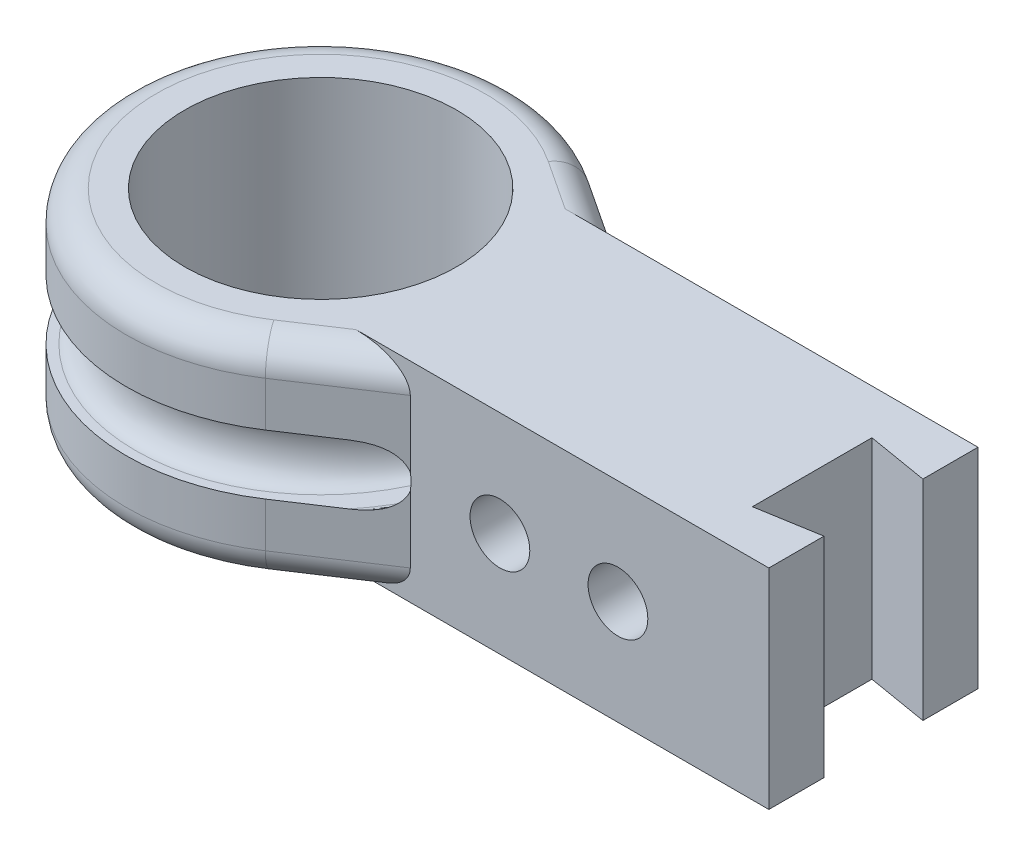
ISO-10303-21;
HEADER;
FILE_DESCRIPTION(('STEP AP214'),'2;1');
FILE_NAME('part.step','',(''),(''),'','','');
FILE_SCHEMA(('AUTOMOTIVE_DESIGN { 1 0 10303 214 1 1 1 1 }'));
ENDSEC;
DATA;
#1=APPLICATION_CONTEXT('core data for automotive mechanical design processes');
#2=APPLICATION_PROTOCOL_DEFINITION('international standard','automotive_design',2000,#1);
#3=PRODUCT_CONTEXT('',#1,'mechanical');
#4=PRODUCT('Part','Part','',(#3));
#5=PRODUCT_RELATED_PRODUCT_CATEGORY('part','',(#4));
#6=PRODUCT_DEFINITION_FORMATION('','',#4);
#7=PRODUCT_DEFINITION_CONTEXT('part definition',#1,'design');
#8=PRODUCT_DEFINITION('design','',#6,#7);
#9=PRODUCT_DEFINITION_SHAPE('','',#8);
#10=(LENGTH_UNIT() NAMED_UNIT(*) SI_UNIT(.MILLI.,.METRE.));
#11=(NAMED_UNIT(*) PLANE_ANGLE_UNIT() SI_UNIT($,.RADIAN.));
#12=(NAMED_UNIT(*) SI_UNIT($,.STERADIAN.) SOLID_ANGLE_UNIT());
#13=UNCERTAINTY_MEASURE_WITH_UNIT(LENGTH_MEASURE(1.E-05),#10,'distance_accuracy_value','');
#14=(GEOMETRIC_REPRESENTATION_CONTEXT(3) GLOBAL_UNCERTAINTY_ASSIGNED_CONTEXT((#13)) GLOBAL_UNIT_ASSIGNED_CONTEXT((#10,
#11,#12)) REPRESENTATION_CONTEXT('',''));
#15=CARTESIAN_POINT('',(0.,0.,0.));
#16=DIRECTION('',(0.,0.,1.));
#17=DIRECTION('',(1.,0.,0.));
#18=AXIS2_PLACEMENT_3D('',#15,#16,#17);
#19=CARTESIAN_POINT('',(6.5,7.,3.5));
#20=DIRECTION('',(0.55045871559633,0.,0.834862385321101));
#21=DIRECTION('',(0.834862385321101,0.,-0.550458715596331));
#22=AXIS2_PLACEMENT_3D('',#19,#20,#21);
#23=PLANE('',#22);
#24=DIRECTION('',(0.,-1.,0.));
#25=VECTOR('',#24,1.);
#26=CARTESIAN_POINT('',(3.57798165137617,7.,5.42660550458714));
#27=LINE('',#26,#25);
#28=CARTESIAN_POINT('',(3.57798165137617,2.5,5.42660550458714));
#29=VERTEX_POINT('',#28);
#30=CARTESIAN_POINT('',(3.57798165137617,1.,5.42660550458714));
#31=VERTEX_POINT('',#30);
#32=EDGE_CURVE('E348',#29,#31,#27,.T.);
#33=ORIENTED_EDGE('',*,*,#32,.T.);
#34=DIRECTION('',(-0.834862385321101,0.,0.550458715596331));
#35=VECTOR('',#34,1.);
#36=CARTESIAN_POINT('',(6.5,1.,3.5));
#37=LINE('',#36,#35);
#38=CARTESIAN_POINT('',(6.5,1.,3.5));
#39=VERTEX_POINT('',#38);
#40=EDGE_CURVE('E442',#31,#39,#37,.F.);
#41=ORIENTED_EDGE('',*,*,#40,.T.);
#42=DIRECTION('',(0.,-1.,0.));
#43=VECTOR('',#42,1.);
#44=CARTESIAN_POINT('',(6.5,7.,3.5));
#45=LINE('',#44,#43);
#46=CARTESIAN_POINT('',(6.5,3.22819521393696,3.5));
#47=VERTEX_POINT('',#46);
#48=EDGE_CURVE('E370',#47,#39,#45,.T.);
#49=ORIENTED_EDGE('',*,*,#48,.F.);
#50=CARTESIAN_POINT('',(6.5,3.22819521393696,3.5));
#51=CARTESIAN_POINT('',(6.49298885962438,3.20469516467334,3.50462272991799));
#52=CARTESIAN_POINT('',(6.48509078213773,3.18159174419673,3.50983025353557));
#53=CARTESIAN_POINT('',(6.4676292095555,3.13632563999783,3.52134337831506));
#54=CARTESIAN_POINT('',(6.45806692554476,3.11416228665261,3.5276481809595));
#55=CARTESIAN_POINT('',(6.4271701424211,3.04954817687565,3.54801968631576));
#56=CARTESIAN_POINT('',(6.40352715088067,3.00864941863856,3.56360847194681));
#57=CARTESIAN_POINT('',(6.35122634688263,2.93199747904386,3.59809251853892));
#58=CARTESIAN_POINT('',(6.32258098093215,2.89623191890055,3.61697957301177));
#59=CARTESIAN_POINT('',(6.26130875530846,2.82999557694114,3.65737884265376));
#60=CARTESIAN_POINT('',(6.22867936221696,2.79952819436519,3.6788927282086));
#61=CARTESIAN_POINT('',(6.14261151228912,2.72931895435917,3.73564076112805));
#62=CARTESIAN_POINT('',(6.08720395804548,2.69304151305721,3.7721732144755));
#63=CARTESIAN_POINT('',(5.97202145654329,2.63130486525718,3.84811772096047));
#64=CARTESIAN_POINT('',(5.91221817444313,2.60592467527972,3.88754845641113));
#65=CARTESIAN_POINT('',(5.80290160328918,2.56869608794661,3.95962531651263));
#66=CARTESIAN_POINT('',(5.75377552755207,2.55514396868166,3.99201613567995));
#67=CARTESIAN_POINT('',(5.65469493921246,2.53298119535897,4.05734399612365));
#68=CARTESIAN_POINT('',(5.6047393361746,2.52437768043018,4.0902817563684));
#69=CARTESIAN_POINT('',(5.50558498743192,2.51141106624854,4.15565825004489));
#70=CARTESIAN_POINT('',(5.45639390173347,2.50695848848075,4.18809193292299));
#71=CARTESIAN_POINT('',(5.35804858954869,2.50126576603422,4.25293499590197));
#72=CARTESIAN_POINT('',(5.30889483077422,2.50001449332246,4.2853440676214));
#73=CARTESIAN_POINT('',(5.25977353990362,2.50000000000001,4.31773173193168));
#74=B_SPLINE_CURVE_WITH_KNOTS('',3,(#50,#51,#52,#53,#54,#55,#56,#57,#58,#59,#60,#61,#62,#63,#64,
#65,#66,#67,#68,#69,#70,#71,#72,#73),.UNSPECIFIED.,.F.,.F.,(4,2,2,2,2,2,2,2,2,2,2,4),(0.,
0.074812067165254,0.149569917637081,0.298065349054375,0.446196437635228,0.594422217290496,
0.820046961292381,1.04728117151874,1.22819830623822,1.40937579153491,1.58655078582427,
1.76310906141737),.UNSPECIFIED.);
#75=CARTESIAN_POINT('',(5.25977353990362,2.5,4.31773173193168));
#76=VERTEX_POINT('',#75);
#77=EDGE_CURVE('E212',#47,#76,#74,.T.);
#78=ORIENTED_EDGE('',*,*,#77,.T.);
#79=DIRECTION('',(-0.834862385321101,0.,0.550458715596331));
#80=VECTOR('',#79,1.);
#81=CARTESIAN_POINT('',(6.5,2.5,3.5));
#82=LINE('',#81,#80);
#83=EDGE_CURVE('E230',#76,#29,#82,.T.);
#84=ORIENTED_EDGE('',*,*,#83,.T.);
#85=EDGE_LOOP('',(#33,#41,#49,#78,#84));
#86=FACE_BOUND('',#85,.T.);
#87=ADVANCED_FACE('F65',(#86),#23,.T.);
#88=CARTESIAN_POINT('',(6.5,6.,3.5));
#89=VERTEX_POINT('',#88);
#90=CARTESIAN_POINT('',(6.5,3.77180478606305,3.5));
#91=VERTEX_POINT('',#90);
#92=EDGE_CURVE('E367',#89,#91,#45,.T.);
#93=ORIENTED_EDGE('',*,*,#92,.F.);
#94=DIRECTION('',(-0.834862385321101,0.,0.550458715596331));
#95=VECTOR('',#94,1.);
#96=CARTESIAN_POINT('',(6.5,6.,3.5));
#97=LINE('',#96,#95);
#98=CARTESIAN_POINT('',(3.57798165137617,6.,5.42660550458714));
#99=VERTEX_POINT('',#98);
#100=EDGE_CURVE('E82',#89,#99,#97,.T.);
#101=ORIENTED_EDGE('',*,*,#100,.T.);
#102=CARTESIAN_POINT('',(3.57798165137617,4.5,5.42660550458714));
#103=VERTEX_POINT('',#102);
#104=EDGE_CURVE('E227',#99,#103,#27,.T.);
#105=ORIENTED_EDGE('',*,*,#104,.T.);
#106=DIRECTION('',(0.834862385321101,0.,-0.550458715596331));
#107=VECTOR('',#106,1.);
#108=CARTESIAN_POINT('',(6.5,4.5,3.5));
#109=LINE('',#108,#107);
#110=CARTESIAN_POINT('',(5.25977353990362,4.5,4.31773173193168));
#111=VERTEX_POINT('',#110);
#112=EDGE_CURVE('E219',#103,#111,#109,.T.);
#113=ORIENTED_EDGE('',*,*,#112,.T.);
#114=CARTESIAN_POINT('',(5.25977353990362,4.49999999999999,4.31773173193168));
#115=CARTESIAN_POINT('',(5.30980424482652,4.49998439536465,4.28474445396054));
#116=CARTESIAN_POINT('',(5.35987068639977,4.49868682887248,4.25173361336279));
#117=CARTESIAN_POINT('',(5.46005090812943,4.49276777287092,4.18568071991466));
#118=CARTESIAN_POINT('',(5.51016414799452,4.48813369889372,4.15263902330032));
#119=CARTESIAN_POINT('',(5.61094447698106,4.47464810066926,4.08619045473776));
#120=CARTESIAN_POINT('',(5.66160493164622,4.46572098860302,4.05278795715634));
#121=CARTESIAN_POINT('',(5.76204144244888,4.44271920763919,3.98656608190183));
#122=CARTESIAN_POINT('',(5.81181878729647,4.42865282179579,3.95374585452979));
#123=CARTESIAN_POINT('',(5.91591925169782,4.39229422808132,3.88510818569373));
#124=CARTESIAN_POINT('',(5.97005539985535,4.36920741181808,3.84941402207339));
#125=CARTESIAN_POINT('',(6.07484169827637,4.31405208518454,3.78032415498262));
#126=CARTESIAN_POINT('',(6.12550687984914,4.2820258141525,3.7469185407588));
#127=CARTESIAN_POINT('',(6.21346194251687,4.21418852231523,3.68892619174711));
#128=CARTESIAN_POINT('',(6.25156972941101,4.17991393322606,3.66380017841032));
#129=CARTESIAN_POINT('',(6.32255321365137,4.10433540844639,3.61699788110899));
#130=CARTESIAN_POINT('',(6.35543710357269,4.06304269401956,3.59531619544659));
#131=CARTESIAN_POINT('',(6.40934731927945,3.98149490764916,3.55977099827729));
#132=CARTESIAN_POINT('',(6.43143912221,3.9422574826338,3.54520497436703));
#133=CARTESIAN_POINT('',(6.46041108861024,3.88047320305739,3.5261025789383));
#134=CARTESIAN_POINT('',(6.46939610863209,3.85931801873014,3.52017838991291));
#135=CARTESIAN_POINT('',(6.4858560007254,3.8161630395596,3.50932571380743));
#136=CARTESIAN_POINT('',(6.49332976949673,3.79416264150562,3.50439795417798));
#137=CARTESIAN_POINT('',(6.5,3.77180478606305,3.5));
#138=B_SPLINE_CURVE_WITH_KNOTS('',3,(#114,#115,#116,#117,#118,#119,#120,#121,#122,#123,#124,
#125,#126,#127,#128,#129,#130,#131,#132,#133,#134,#135,#136,#137),.UNSPECIFIED.,.F.,.F.,(4,2,2,
2,2,2,2,2,2,2,2,4),(0.,0.179831729267228,0.360345315866386,0.544160534446972,0.727680792492196,
0.933606689487284,1.13857558490959,1.309156452813,1.47946710193905,1.62081594714583,
1.69194682388597,1.76312944423503),.UNSPECIFIED.);
#139=EDGE_CURVE('E203',#111,#91,#138,.T.);
#140=ORIENTED_EDGE('',*,*,#139,.T.);
#141=EDGE_LOOP('',(#93,#101,#105,#113,#140));
#142=FACE_BOUND('',#141,.T.);
#143=ADVANCED_FACE('F226',(#142),#23,.T.);
#144=CARTESIAN_POINT('',(6.5,7.,3.5));
#145=DIRECTION('',(0.,0.,-1.));
#146=DIRECTION('',(-1.,0.,0.));
#147=AXIS2_PLACEMENT_3D('',#144,#145,#146);
#148=PLANE('',#147);
#149=CARTESIAN_POINT('',(9.5,3.5,3.5));
#150=DIRECTION('',(0.,0.,1.));
#151=DIRECTION('',(1.,0.,0.));
#152=AXIS2_PLACEMENT_3D('',#149,#150,#151);
#153=CIRCLE('',#152,1.);
#154=CARTESIAN_POINT('',(10.5,3.5,3.5));
#155=VERTEX_POINT('',#154);
#156=EDGE_CURVE('E224',#155,#155,#153,.T.);
#157=ORIENTED_EDGE('',*,*,#156,.F.);
#158=EDGE_LOOP('',(#157));
#159=FACE_BOUND('',#158,.T.);
#160=CARTESIAN_POINT('',(13.45,3.5,3.5));
#161=DIRECTION('',(0.,0.,1.));
#162=DIRECTION('',(1.,0.,0.));
#163=AXIS2_PLACEMENT_3D('',#160,#161,#162);
#164=CIRCLE('',#163,1.);
#165=CARTESIAN_POINT('',(14.45,3.5,3.5));
#166=VERTEX_POINT('',#165);
#167=EDGE_CURVE('E271',#166,#166,#164,.T.);
#168=ORIENTED_EDGE('',*,*,#167,.F.);
#169=EDGE_LOOP('',(#168));
#170=FACE_BOUND('',#169,.T.);
#171=CARTESIAN_POINT('',(6.5,3.22819521393696,3.5));
#172=CARTESIAN_POINT('',(6.5304746179953,3.391795322888,3.50000000000001));
#173=CARTESIAN_POINT('',(6.53381508751579,3.55338363151334,3.50000000000001));
#174=CARTESIAN_POINT('',(6.50709218233565,3.73260551260419,3.5));
#175=CARTESIAN_POINT('',(6.50375171281517,3.75222039468755,3.5));
#176=CARTESIAN_POINT('',(6.5,3.77180478606305,3.5));
#177=B_SPLINE_CURVE_WITH_KNOTS('',3,(#171,#172,#173,#174,#175,#176),.UNSPECIFIED.,.F.,.F.,(4,2,
4),(0.,0.48486849968743,0.544560383740886),.UNSPECIFIED.);
#178=EDGE_CURVE('E210',#47,#91,#177,.T.);
#179=ORIENTED_EDGE('',*,*,#178,.F.);
#180=ORIENTED_EDGE('',*,*,#48,.T.);
#181=CARTESIAN_POINT('',(4.68333333333333,1.,3.5));
#182=DIRECTION('',(0.,0.,-1.));
#183=DIRECTION('',(1.,0.,0.));
#184=AXIS2_PLACEMENT_3D('',#181,#182,#183);
#185=ELLIPSE('',#184,1.81666666666667,1.);
#186=CARTESIAN_POINT('',(4.68333333333333,0.,3.5));
#187=VERTEX_POINT('',#186);
#188=EDGE_CURVE('E460',#39,#187,#185,.T.);
#189=ORIENTED_EDGE('',*,*,#188,.T.);
#190=DIRECTION('',(1.,0.,0.));
#191=VECTOR('',#190,1.);
#192=CARTESIAN_POINT('',(6.5,0.,3.5));
#193=LINE('',#192,#191);
#194=CARTESIAN_POINT('',(18.5,0.,3.5));
#195=VERTEX_POINT('',#194);
#196=EDGE_CURVE('E334',#187,#195,#193,.T.);
#197=ORIENTED_EDGE('',*,*,#196,.T.);
#198=DIRECTION('',(0.,-1.,0.));
#199=VECTOR('',#198,1.);
#200=CARTESIAN_POINT('',(18.5,7.,3.5));
#201=LINE('',#200,#199);
#202=CARTESIAN_POINT('',(18.5,7.,3.5));
#203=VERTEX_POINT('',#202);
#204=EDGE_CURVE('E371',#203,#195,#201,.T.);
#205=ORIENTED_EDGE('',*,*,#204,.F.);
#206=DIRECTION('',(1.,0.,0.));
#207=VECTOR('',#206,1.);
#208=CARTESIAN_POINT('',(6.5,7.,3.5));
#209=LINE('',#208,#207);
#210=CARTESIAN_POINT('',(4.68333333333333,7.,3.5));
#211=VERTEX_POINT('',#210);
#212=EDGE_CURVE('E346',#211,#203,#209,.T.);
#213=ORIENTED_EDGE('',*,*,#212,.F.);
#214=CARTESIAN_POINT('',(4.68333333333333,6.,3.5));
#215=DIRECTION('',(0.,0.,-1.));
#216=DIRECTION('',(-1.,0.,0.));
#217=AXIS2_PLACEMENT_3D('',#214,#215,#216);
#218=ELLIPSE('',#217,1.81666666666667,1.);
#219=EDGE_CURVE('E12',#211,#89,#218,.T.);
#220=ORIENTED_EDGE('',*,*,#219,.T.);
#221=ORIENTED_EDGE('',*,*,#92,.T.);
#222=EDGE_LOOP('',(#179,#180,#189,#197,#205,#213,#220,#221));
#223=FACE_BOUND('',#222,.T.);
#224=ADVANCED_FACE('F303',(#159,#170,#223),#148,.F.);
#225=CARTESIAN_POINT('',(6.5,7.,-3.5));
#226=DIRECTION('',(0.,0.,-1.));
#227=DIRECTION('',(-1.,0.,0.));
#228=AXIS2_PLACEMENT_3D('',#225,#226,#227);
#229=PLANE('',#228);
#230=CARTESIAN_POINT('',(9.5,3.5,-3.5));
#231=DIRECTION('',(0.,0.,-1.));
#232=DIRECTION('',(-1.,0.,0.));
#233=AXIS2_PLACEMENT_3D('',#230,#231,#232);
#234=CIRCLE('',#233,1.);
#235=CARTESIAN_POINT('',(8.5,3.5,-3.5));
#236=VERTEX_POINT('',#235);
#237=EDGE_CURVE('E720',#236,#236,#234,.F.);
#238=ORIENTED_EDGE('',*,*,#237,.T.);
#239=EDGE_LOOP('',(#238));
#240=FACE_BOUND('',#239,.T.);
#241=CARTESIAN_POINT('',(13.45,3.5,-3.5));
#242=DIRECTION('',(0.,0.,-1.));
#243=DIRECTION('',(-1.,0.,0.));
#244=AXIS2_PLACEMENT_3D('',#241,#242,#243);
#245=CIRCLE('',#244,1.);
#246=CARTESIAN_POINT('',(12.45,3.5,-3.5));
#247=VERTEX_POINT('',#246);
#248=EDGE_CURVE('E718',#247,#247,#245,.F.);
#249=ORIENTED_EDGE('',*,*,#248,.T.);
#250=EDGE_LOOP('',(#249));
#251=FACE_BOUND('',#250,.T.);
#252=DIRECTION('',(0.,-1.,0.));
#253=VECTOR('',#252,1.);
#254=CARTESIAN_POINT('',(6.5,7.,-3.5));
#255=LINE('',#254,#253);
#256=CARTESIAN_POINT('',(6.5,3.22819521393695,-3.5));
#257=VERTEX_POINT('',#256);
#258=CARTESIAN_POINT('',(6.5,1.,-3.5));
#259=VERTEX_POINT('',#258);
#260=EDGE_CURVE('E386',#257,#259,#255,.T.);
#261=ORIENTED_EDGE('',*,*,#260,.F.);
#262=CARTESIAN_POINT('',(6.5,3.22819521393695,-3.5));
#263=CARTESIAN_POINT('',(6.53047461799531,3.39179532288799,-3.49999999999998));
#264=CARTESIAN_POINT('',(6.5338150875158,3.55338363151333,-3.49999999999998));
#265=CARTESIAN_POINT('',(6.50709218233565,3.73260551260419,-3.5));
#266=CARTESIAN_POINT('',(6.50375171281517,3.75222039468755,-3.5));
#267=CARTESIAN_POINT('',(6.5,3.77180478606305,-3.5));
#268=B_SPLINE_CURVE_WITH_KNOTS('',3,(#262,#263,#264,#265,#266,#267),.UNSPECIFIED.,.F.,.F.,(4,2,
4),(0.,0.48486849968743,0.544560383740898),.UNSPECIFIED.);
#269=CARTESIAN_POINT('',(6.5,3.77180478606305,-3.5));
#270=VERTEX_POINT('',#269);
#271=EDGE_CURVE('E238',#257,#270,#268,.T.);
#272=ORIENTED_EDGE('',*,*,#271,.T.);
#273=CARTESIAN_POINT('',(6.5,6.,-3.5));
#274=VERTEX_POINT('',#273);
#275=EDGE_CURVE('E384',#274,#270,#255,.T.);
#276=ORIENTED_EDGE('',*,*,#275,.F.);
#277=CARTESIAN_POINT('',(4.68333333333333,6.,-3.5));
#278=DIRECTION('',(0.,0.,-1.));
#279=DIRECTION('',(1.,0.,0.));
#280=AXIS2_PLACEMENT_3D('',#277,#278,#279);
#281=ELLIPSE('',#280,1.81666666666667,1.);
#282=CARTESIAN_POINT('',(4.68333333333333,7.,-3.5));
#283=VERTEX_POINT('',#282);
#284=EDGE_CURVE('E74',#274,#283,#281,.F.);
#285=ORIENTED_EDGE('',*,*,#284,.T.);
#286=DIRECTION('',(1.,0.,0.));
#287=VECTOR('',#286,1.);
#288=CARTESIAN_POINT('',(6.5,7.,-3.5));
#289=LINE('',#288,#287);
#290=CARTESIAN_POINT('',(18.5,7.,-3.5));
#291=VERTEX_POINT('',#290);
#292=EDGE_CURVE('E330',#283,#291,#289,.T.);
#293=ORIENTED_EDGE('',*,*,#292,.T.);
#294=DIRECTION('',(0.,-1.,0.));
#295=VECTOR('',#294,1.);
#296=CARTESIAN_POINT('',(18.5,7.,-3.5));
#297=LINE('',#296,#295);
#298=CARTESIAN_POINT('',(18.5,0.,-3.5));
#299=VERTEX_POINT('',#298);
#300=EDGE_CURVE('E382',#291,#299,#297,.T.);
#301=ORIENTED_EDGE('',*,*,#300,.T.);
#302=DIRECTION('',(1.,0.,0.));
#303=VECTOR('',#302,1.);
#304=CARTESIAN_POINT('',(6.5,0.,-3.5));
#305=LINE('',#304,#303);
#306=CARTESIAN_POINT('',(4.68333333333333,0.,-3.5));
#307=VERTEX_POINT('',#306);
#308=EDGE_CURVE('E327',#307,#299,#305,.T.);
#309=ORIENTED_EDGE('',*,*,#308,.F.);
#310=CARTESIAN_POINT('',(4.68333333333333,1.,-3.5));
#311=DIRECTION('',(0.,0.,-1.));
#312=DIRECTION('',(-1.,0.,0.));
#313=AXIS2_PLACEMENT_3D('',#310,#311,#312);
#314=ELLIPSE('',#313,1.81666666666667,1.);
#315=EDGE_CURVE('E430',#307,#259,#314,.F.);
#316=ORIENTED_EDGE('',*,*,#315,.T.);
#317=EDGE_LOOP('',(#261,#272,#276,#285,#293,#301,#309,#316));
#318=FACE_BOUND('',#317,.T.);
#319=ADVANCED_FACE('F252',(#240,#251,#318),#229,.T.);
#320=CARTESIAN_POINT('',(6.5,7.,-3.5));
#321=DIRECTION('',(-0.550458715596331,0.,0.834862385321101));
#322=DIRECTION('',(0.834862385321101,0.,0.550458715596331));
#323=AXIS2_PLACEMENT_3D('',#320,#321,#322);
#324=PLANE('',#323);
#325=ORIENTED_EDGE('',*,*,#260,.T.);
#326=DIRECTION('',(-0.834862385321101,0.,-0.550458715596331));
#327=VECTOR('',#326,1.);
#328=CARTESIAN_POINT('',(6.5,1.,-3.5));
#329=LINE('',#328,#327);
#330=CARTESIAN_POINT('',(3.57798165137615,1.,-5.42660550458716));
#331=VERTEX_POINT('',#330);
#332=EDGE_CURVE('E423',#259,#331,#329,.T.);
#333=ORIENTED_EDGE('',*,*,#332,.T.);
#334=DIRECTION('',(0.,-1.,0.));
#335=VECTOR('',#334,1.);
#336=CARTESIAN_POINT('',(3.57798165137615,7.,-5.42660550458716));
#337=LINE('',#336,#335);
#338=CARTESIAN_POINT('',(3.57798165137615,2.5,-5.42660550458716));
#339=VERTEX_POINT('',#338);
#340=EDGE_CURVE('E389',#339,#331,#337,.T.);
#341=ORIENTED_EDGE('',*,*,#340,.F.);
#342=DIRECTION('',(-0.834862385321101,0.,-0.550458715596331));
#343=VECTOR('',#342,1.);
#344=CARTESIAN_POINT('',(6.5,2.5,-3.5));
#345=LINE('',#344,#343);
#346=CARTESIAN_POINT('',(5.25977353990362,2.5,-4.31773173193168));
#347=VERTEX_POINT('',#346);
#348=EDGE_CURVE('E228',#347,#339,#345,.T.);
#349=ORIENTED_EDGE('',*,*,#348,.F.);
#350=CARTESIAN_POINT('',(6.5,3.22819521393695,-3.5));
#351=CARTESIAN_POINT('',(6.49298885962437,3.20469516467334,-3.50462272991799));
#352=CARTESIAN_POINT('',(6.48509078213772,3.18159174419672,-3.50983025353557));
#353=CARTESIAN_POINT('',(6.4676292095555,3.13632563999783,-3.52134337831506));
#354=CARTESIAN_POINT('',(6.45806692554476,3.1141622866526,-3.5276481809595));
#355=CARTESIAN_POINT('',(6.4271701424211,3.04954817687564,-3.54801968631576));
#356=CARTESIAN_POINT('',(6.40352715088067,3.00864941863855,-3.56360847194681));
#357=CARTESIAN_POINT('',(6.35122634688263,2.93199747904385,-3.59809251853893));
#358=CARTESIAN_POINT('',(6.32258098093214,2.89623191890054,-3.61697957301177));
#359=CARTESIAN_POINT('',(6.26130875530845,2.82999557694114,-3.65737884265377));
#360=CARTESIAN_POINT('',(6.22867936221695,2.79952819436519,-3.6788927282086));
#361=CARTESIAN_POINT('',(6.14261151228911,2.72931895435917,-3.73564076112805));
#362=CARTESIAN_POINT('',(6.08720395804548,2.69304151305721,-3.77217321447551));
#363=CARTESIAN_POINT('',(5.97202145654328,2.63130486525718,-3.84811772096047));
#364=CARTESIAN_POINT('',(5.91221817444312,2.60592467527971,-3.88754845641113));
#365=CARTESIAN_POINT('',(5.80290160328917,2.5686960879466,-3.95962531651264));
#366=CARTESIAN_POINT('',(5.75377552755207,2.55514396868166,-3.99201613567995));
#367=CARTESIAN_POINT('',(5.65469493921245,2.53298119535897,-4.05734399612366));
#368=CARTESIAN_POINT('',(5.60473933617459,2.52437768043018,-4.0902817563684));
#369=CARTESIAN_POINT('',(5.50558498743192,2.51141106624854,-4.15565825004489));
#370=CARTESIAN_POINT('',(5.45639390173347,2.50695848848075,-4.18809193292299));
#371=CARTESIAN_POINT('',(5.35804858954869,2.50126576603422,-4.25293499590196));
#372=CARTESIAN_POINT('',(5.30889483077422,2.50001449332246,-4.28534406762139));
#373=CARTESIAN_POINT('',(5.25977353990362,2.50000000000001,-4.31773173193167));
#374=B_SPLINE_CURVE_WITH_KNOTS('',3,(#350,#351,#352,#353,#354,#355,#356,#357,#358,#359,#360,
#361,#362,#363,#364,#365,#366,#367,#368,#369,#370,#371,#372,#373),.UNSPECIFIED.,.F.,.F.,(4,2,2,
2,2,2,2,2,2,2,2,4),(0.,0.0748120671652539,0.149569917637081,0.298065349054377,0.446196437635229,
0.594422217290497,0.820046961292383,1.04728117151874,1.22819830623822,1.40937579153491,
1.58655078582426,1.76310906141736),.UNSPECIFIED.);
#375=EDGE_CURVE('E399',#257,#347,#374,.T.);
#376=ORIENTED_EDGE('',*,*,#375,.F.);
#377=EDGE_LOOP('',(#325,#333,#341,#349,#376));
#378=FACE_BOUND('',#377,.T.);
#379=ADVANCED_FACE('F405',(#378),#324,.F.);
#380=CARTESIAN_POINT('',(3.57798165137615,6.,-5.42660550458716));
#381=VERTEX_POINT('',#380);
#382=CARTESIAN_POINT('',(3.57798165137615,4.5,-5.42660550458716));
#383=VERTEX_POINT('',#382);
#384=EDGE_CURVE('E387',#381,#383,#337,.T.);
#385=ORIENTED_EDGE('',*,*,#384,.F.);
#386=DIRECTION('',(-0.834862385321101,0.,-0.550458715596331));
#387=VECTOR('',#386,1.);
#388=CARTESIAN_POINT('',(6.5,6.,-3.5));
#389=LINE('',#388,#387);
#390=EDGE_CURVE('E452',#381,#274,#389,.F.);
#391=ORIENTED_EDGE('',*,*,#390,.T.);
#392=ORIENTED_EDGE('',*,*,#275,.T.);
#393=CARTESIAN_POINT('',(5.25977353990362,4.49999999999999,-4.31773173193168));
#394=CARTESIAN_POINT('',(5.30980424482652,4.49998439536465,-4.28474445396054));
#395=CARTESIAN_POINT('',(5.35987068639978,4.49868682887249,-4.25173361336279));
#396=CARTESIAN_POINT('',(5.46005090812944,4.49276777287092,-4.18568071991466));
#397=CARTESIAN_POINT('',(5.51016414799452,4.48813369889372,-4.15263902330031));
#398=CARTESIAN_POINT('',(5.61094447698106,4.47464810066926,-4.08619045473776));
#399=CARTESIAN_POINT('',(5.66160493164622,4.46572098860302,-4.05278795715634));
#400=CARTESIAN_POINT('',(5.76204144244888,4.44271920763919,-3.98656608190183));
#401=CARTESIAN_POINT('',(5.81181878729647,4.42865282179579,-3.95374585452979));
#402=CARTESIAN_POINT('',(5.91591925169783,4.39229422808132,-3.88510818569373));
#403=CARTESIAN_POINT('',(5.97005539985535,4.36920741181808,-3.84941402207339));
#404=CARTESIAN_POINT('',(6.07484169827637,4.31405208518454,-3.78032415498262));
#405=CARTESIAN_POINT('',(6.12550687984914,4.2820258141525,-3.7469185407588));
#406=CARTESIAN_POINT('',(6.21346194251688,4.21418852231523,-3.68892619174711));
#407=CARTESIAN_POINT('',(6.25156972941101,4.17991393322605,-3.66380017841032));
#408=CARTESIAN_POINT('',(6.32255321365138,4.10433540844639,-3.61699788110898));
#409=CARTESIAN_POINT('',(6.35543710357269,4.06304269401956,-3.59531619544657));
#410=CARTESIAN_POINT('',(6.40934731927945,3.98149490764916,-3.55977099827728));
#411=CARTESIAN_POINT('',(6.43143912221,3.9422574826338,-3.54520497436703));
#412=CARTESIAN_POINT('',(6.46041108861024,3.88047320305738,-3.5261025789383));
#413=CARTESIAN_POINT('',(6.46939610863209,3.85931801873014,-3.52017838991291));
#414=CARTESIAN_POINT('',(6.4858560007254,3.81616303955961,-3.50932571380743));
#415=CARTESIAN_POINT('',(6.49332976949673,3.79416264150563,-3.50439795417798));
#416=CARTESIAN_POINT('',(6.5,3.77180478606305,-3.5));
#417=B_SPLINE_CURVE_WITH_KNOTS('',3,(#393,#394,#395,#396,#397,#398,#399,#400,#401,#402,#403,
#404,#405,#406,#407,#408,#409,#410,#411,#412,#413,#414,#415,#416),.UNSPECIFIED.,.F.,.F.,(4,2,2,
2,2,2,2,2,2,2,2,4),(0.,0.179831729267229,0.360345315866388,0.544160534446972,0.727680792492197,
0.933606689487283,1.13857558490959,1.309156452813,1.47946710193905,1.62081594714583,
1.69194682388597,1.76312944423502),.UNSPECIFIED.);
#418=CARTESIAN_POINT('',(5.25977353990362,4.5,-4.31773173193168));
#419=VERTEX_POINT('',#418);
#420=EDGE_CURVE('E393',#419,#270,#417,.T.);
#421=ORIENTED_EDGE('',*,*,#420,.F.);
#422=DIRECTION('',(0.834862385321101,0.,0.550458715596331));
#423=VECTOR('',#422,1.);
#424=CARTESIAN_POINT('',(6.5,4.5,-3.5));
#425=LINE('',#424,#423);
#426=EDGE_CURVE('E222',#383,#419,#425,.T.);
#427=ORIENTED_EDGE('',*,*,#426,.F.);
#428=EDGE_LOOP('',(#385,#391,#392,#421,#427));
#429=FACE_BOUND('',#428,.T.);
#430=ADVANCED_FACE('F408',(#429),#324,.F.);
#431=CARTESIAN_POINT('',(0.,7.,0.));
#432=DIRECTION('',(0.,-1.,0.));
#433=DIRECTION('',(0.,0.,-1.));
#434=AXIS2_PLACEMENT_3D('',#431,#432,#433);
#435=CYLINDRICAL_SURFACE('',#434,6.5);
#436=ORIENTED_EDGE('',*,*,#340,.T.);
#437=CARTESIAN_POINT('',(0.,1.,0.));
#438=DIRECTION('',(0.,1.,0.));
#439=DIRECTION('',(0.,0.,1.));
#440=AXIS2_PLACEMENT_3D('',#437,#438,#439);
#441=CIRCLE('',#440,6.5);
#442=EDGE_CURVE('E455',#331,#31,#441,.T.);
#443=ORIENTED_EDGE('',*,*,#442,.T.);
#444=ORIENTED_EDGE('',*,*,#32,.F.);
#445=CARTESIAN_POINT('',(0.,2.5,0.));
#446=DIRECTION('',(0.,1.,0.));
#447=DIRECTION('',(0.,0.,1.));
#448=AXIS2_PLACEMENT_3D('',#445,#446,#447);
#449=CIRCLE('',#448,6.5);
#450=EDGE_CURVE('E392',#339,#29,#449,.T.);
#451=ORIENTED_EDGE('',*,*,#450,.F.);
#452=EDGE_LOOP('',(#436,#443,#444,#451));
#453=FACE_BOUND('',#452,.T.);
#454=ADVANCED_FACE('F308',(#453),#435,.T.);
#455=ORIENTED_EDGE('',*,*,#104,.F.);
#456=CARTESIAN_POINT('',(0.,6.,0.));
#457=DIRECTION('',(0.,1.,0.));
#458=DIRECTION('',(0.,0.,1.));
#459=AXIS2_PLACEMENT_3D('',#456,#457,#458);
#460=CIRCLE('',#459,6.5);
#461=EDGE_CURVE('E457',#99,#381,#460,.F.);
#462=ORIENTED_EDGE('',*,*,#461,.T.);
#463=ORIENTED_EDGE('',*,*,#384,.T.);
#464=CARTESIAN_POINT('',(0.,4.5,0.));
#465=DIRECTION('',(0.,-1.,0.));
#466=DIRECTION('',(0.,0.,-1.));
#467=AXIS2_PLACEMENT_3D('',#464,#465,#466);
#468=CIRCLE('',#467,6.5);
#469=EDGE_CURVE('E369',#103,#383,#468,.T.);
#470=ORIENTED_EDGE('',*,*,#469,.F.);
#471=EDGE_LOOP('',(#455,#462,#463,#470));
#472=FACE_BOUND('',#471,.T.);
#473=ADVANCED_FACE('F577',(#472),#435,.T.);
#474=CARTESIAN_POINT('',(0.,7.,0.));
#475=DIRECTION('',(0.,1.,0.));
#476=DIRECTION('',(0.,0.,1.));
#477=AXIS2_PLACEMENT_3D('',#474,#475,#476);
#478=PLANE('',#477);
#479=ORIENTED_EDGE('',*,*,#292,.F.);
#480=DIRECTION('',(-0.834862385321101,0.,-0.550458715596331));
#481=VECTOR('',#480,1.);
#482=CARTESIAN_POINT('',(3.02752293577982,7.,-4.59174311926605));
#483=LINE('',#482,#481);
#484=CARTESIAN_POINT('',(3.02752293577982,7.,-4.59174311926605));
#485=VERTEX_POINT('',#484);
#486=EDGE_CURVE('E449',#283,#485,#483,.T.);
#487=ORIENTED_EDGE('',*,*,#486,.T.);
#488=CARTESIAN_POINT('',(0.,7.,0.));
#489=DIRECTION('',(0.,1.,0.));
#490=DIRECTION('',(0.,0.,1.));
#491=AXIS2_PLACEMENT_3D('',#488,#489,#490);
#492=CIRCLE('',#491,5.5);
#493=CARTESIAN_POINT('',(3.02752293577984,7.,4.59174311926604));
#494=VERTEX_POINT('',#493);
#495=EDGE_CURVE('E444',#485,#494,#492,.T.);
#496=ORIENTED_EDGE('',*,*,#495,.T.);
#497=DIRECTION('',(-0.834862385321101,0.,0.550458715596331));
#498=VECTOR('',#497,1.);
#499=CARTESIAN_POINT('',(3.02752293577982,7.,4.59174311926605));
#500=LINE('',#499,#498);
#501=EDGE_CURVE('E446',#494,#211,#500,.F.);
#502=ORIENTED_EDGE('',*,*,#501,.T.);
#503=ORIENTED_EDGE('',*,*,#212,.T.);
#504=DIRECTION('',(0.,0.,-1.));
#505=VECTOR('',#504,1.);
#506=CARTESIAN_POINT('',(18.5,7.,3.5));
#507=LINE('',#506,#505);
#508=CARTESIAN_POINT('',(18.5,7.,1.655));
#509=VERTEX_POINT('',#508);
#510=EDGE_CURVE('E344',#203,#509,#507,.T.);
#511=ORIENTED_EDGE('',*,*,#510,.T.);
#512=DIRECTION('',(0.986132668242457,0.,-0.165958912460317));
#513=VECTOR('',#512,1.);
#514=CARTESIAN_POINT('',(16.45,7.,2.));
#515=LINE('',#514,#513);
#516=CARTESIAN_POINT('',(16.45,7.,2.));
#517=VERTEX_POINT('',#516);
#518=EDGE_CURVE('E341',#517,#509,#515,.T.);
#519=ORIENTED_EDGE('',*,*,#518,.F.);
#520=DIRECTION('',(0.,0.,-1.));
#521=VECTOR('',#520,1.);
#522=CARTESIAN_POINT('',(16.45,7.,2.));
#523=LINE('',#522,#521);
#524=CARTESIAN_POINT('',(16.45,7.,-2.));
#525=VERTEX_POINT('',#524);
#526=EDGE_CURVE('E339',#517,#525,#523,.T.);
#527=ORIENTED_EDGE('',*,*,#526,.T.);
#528=DIRECTION('',(-0.986132668242457,0.,-0.165958912460317));
#529=VECTOR('',#528,1.);
#530=CARTESIAN_POINT('',(18.5,7.,-1.655));
#531=LINE('',#530,#529);
#532=CARTESIAN_POINT('',(18.5,7.,-1.655));
#533=VERTEX_POINT('',#532);
#534=EDGE_CURVE('E336',#533,#525,#531,.T.);
#535=ORIENTED_EDGE('',*,*,#534,.F.);
#536=DIRECTION('',(0.,0.,-1.));
#537=VECTOR('',#536,1.);
#538=CARTESIAN_POINT('',(18.5,7.,-1.655));
#539=LINE('',#538,#537);
#540=EDGE_CURVE('E333',#533,#291,#539,.T.);
#541=ORIENTED_EDGE('',*,*,#540,.T.);
#542=EDGE_LOOP('',(#479,#487,#496,#502,#503,#511,#519,#527,#535,#541));
#543=FACE_BOUND('',#542,.T.);
#544=CARTESIAN_POINT('',(0.,7.,0.));
#545=DIRECTION('',(0.,1.,0.));
#546=DIRECTION('',(0.,0.,1.));
#547=AXIS2_PLACEMENT_3D('',#544,#545,#546);
#548=CIRCLE('',#547,4.55);
#549=CARTESIAN_POINT('',(0.,7.,4.55));
#550=VERTEX_POINT('',#549);
#551=EDGE_CURVE('E324',#550,#550,#548,.T.);
#552=ORIENTED_EDGE('',*,*,#551,.F.);
#553=EDGE_LOOP('',(#552));
#554=FACE_BOUND('',#553,.T.);
#555=ADVANCED_FACE('F482',(#543,#554),#478,.T.);
#556=CARTESIAN_POINT('',(0.,0.,0.));
#557=DIRECTION('',(0.,1.,0.));
#558=DIRECTION('',(0.,0.,1.));
#559=AXIS2_PLACEMENT_3D('',#556,#557,#558);
#560=PLANE('',#559);
#561=DIRECTION('',(-0.834862385321101,0.,-0.550458715596331));
#562=VECTOR('',#561,1.);
#563=CARTESIAN_POINT('',(3.02752293577982,0.,-4.59174311926605));
#564=LINE('',#563,#562);
#565=CARTESIAN_POINT('',(3.02752293577982,0.,-4.59174311926605));
#566=VERTEX_POINT('',#565);
#567=EDGE_CURVE('E439',#566,#307,#564,.F.);
#568=ORIENTED_EDGE('',*,*,#567,.T.);
#569=ORIENTED_EDGE('',*,*,#308,.T.);
#570=DIRECTION('',(0.,0.,-1.));
#571=VECTOR('',#570,1.);
#572=CARTESIAN_POINT('',(18.5,0.,-1.655));
#573=LINE('',#572,#571);
#574=CARTESIAN_POINT('',(18.5,0.,-1.655));
#575=VERTEX_POINT('',#574);
#576=EDGE_CURVE('E351',#575,#299,#573,.T.);
#577=ORIENTED_EDGE('',*,*,#576,.F.);
#578=DIRECTION('',(-0.986132668242457,0.,-0.165958912460317));
#579=VECTOR('',#578,1.);
#580=CARTESIAN_POINT('',(18.5,0.,-1.655));
#581=LINE('',#580,#579);
#582=CARTESIAN_POINT('',(16.45,0.,-2.));
#583=VERTEX_POINT('',#582);
#584=EDGE_CURVE('E354',#575,#583,#581,.T.);
#585=ORIENTED_EDGE('',*,*,#584,.T.);
#586=DIRECTION('',(0.,0.,-1.));
#587=VECTOR('',#586,1.);
#588=CARTESIAN_POINT('',(16.45,0.,2.));
#589=LINE('',#588,#587);
#590=CARTESIAN_POINT('',(16.45,0.,2.));
#591=VERTEX_POINT('',#590);
#592=EDGE_CURVE('E357',#591,#583,#589,.T.);
#593=ORIENTED_EDGE('',*,*,#592,.F.);
#594=DIRECTION('',(0.986132668242457,0.,-0.165958912460317));
#595=VECTOR('',#594,1.);
#596=CARTESIAN_POINT('',(16.45,0.,2.));
#597=LINE('',#596,#595);
#598=CARTESIAN_POINT('',(18.5,0.,1.655));
#599=VERTEX_POINT('',#598);
#600=EDGE_CURVE('E360',#591,#599,#597,.T.);
#601=ORIENTED_EDGE('',*,*,#600,.T.);
#602=DIRECTION('',(0.,0.,-1.));
#603=VECTOR('',#602,1.);
#604=CARTESIAN_POINT('',(18.5,0.,3.5));
#605=LINE('',#604,#603);
#606=EDGE_CURVE('E363',#195,#599,#605,.T.);
#607=ORIENTED_EDGE('',*,*,#606,.F.);
#608=ORIENTED_EDGE('',*,*,#196,.F.);
#609=DIRECTION('',(-0.834862385321101,0.,0.550458715596331));
#610=VECTOR('',#609,1.);
#611=CARTESIAN_POINT('',(3.02752293577984,0.,4.59174311926604));
#612=LINE('',#611,#610);
#613=CARTESIAN_POINT('',(3.02752293577984,0.,4.59174311926604));
#614=VERTEX_POINT('',#613);
#615=EDGE_CURVE('E435',#187,#614,#612,.T.);
#616=ORIENTED_EDGE('',*,*,#615,.T.);
#617=CARTESIAN_POINT('',(0.,0.,0.));
#618=DIRECTION('',(0.,1.,0.));
#619=DIRECTION('',(0.,0.,1.));
#620=AXIS2_PLACEMENT_3D('',#617,#618,#619);
#621=CIRCLE('',#620,5.5);
#622=EDGE_CURVE('E434',#614,#566,#621,.F.);
#623=ORIENTED_EDGE('',*,*,#622,.T.);
#624=EDGE_LOOP('',(#568,#569,#577,#585,#593,#601,#607,#608,#616,#623));
#625=FACE_BOUND('',#624,.T.);
#626=CARTESIAN_POINT('',(0.,0.,0.));
#627=DIRECTION('',(0.,1.,0.));
#628=DIRECTION('',(0.,0.,1.));
#629=AXIS2_PLACEMENT_3D('',#626,#627,#628);
#630=CIRCLE('',#629,4.55);
#631=CARTESIAN_POINT('',(0.,0.,4.55));
#632=VERTEX_POINT('',#631);
#633=EDGE_CURVE('E323',#632,#632,#630,.T.);
#634=ORIENTED_EDGE('',*,*,#633,.T.);
#635=EDGE_LOOP('',(#634));
#636=FACE_BOUND('',#635,.T.);
#637=ADVANCED_FACE('F505',(#625,#636),#560,.F.);
#638=CARTESIAN_POINT('',(18.5,7.,3.5));
#639=DIRECTION('',(-1.,0.,0.));
#640=DIRECTION('',(0.,0.,1.));
#641=AXIS2_PLACEMENT_3D('',#638,#639,#640);
#642=PLANE('',#641);
#643=ORIENTED_EDGE('',*,*,#606,.T.);
#644=DIRECTION('',(0.,-1.,0.));
#645=VECTOR('',#644,1.);
#646=CARTESIAN_POINT('',(18.5,7.,1.655));
#647=LINE('',#646,#645);
#648=EDGE_CURVE('E374',#509,#599,#647,.T.);
#649=ORIENTED_EDGE('',*,*,#648,.F.);
#650=ORIENTED_EDGE('',*,*,#510,.F.);
#651=ORIENTED_EDGE('',*,*,#204,.T.);
#652=EDGE_LOOP('',(#643,#649,#650,#651));
#653=FACE_BOUND('',#652,.T.);
#654=ADVANCED_FACE('F510',(#653),#642,.F.);
#655=CARTESIAN_POINT('',(16.45,7.,2.));
#656=DIRECTION('',(-0.165958912460317,0.,-0.986132668242457));
#657=DIRECTION('',(-0.986132668242457,0.,0.165958912460317));
#658=AXIS2_PLACEMENT_3D('',#655,#656,#657);
#659=PLANE('',#658);
#660=ORIENTED_EDGE('',*,*,#600,.F.);
#661=DIRECTION('',(0.,-1.,0.));
#662=VECTOR('',#661,1.);
#663=CARTESIAN_POINT('',(16.45,7.,2.));
#664=LINE('',#663,#662);
#665=EDGE_CURVE('E376',#517,#591,#664,.T.);
#666=ORIENTED_EDGE('',*,*,#665,.F.);
#667=ORIENTED_EDGE('',*,*,#518,.T.);
#668=ORIENTED_EDGE('',*,*,#648,.T.);
#669=EDGE_LOOP('',(#660,#666,#667,#668));
#670=FACE_BOUND('',#669,.T.);
#671=ADVANCED_FACE('F518',(#670),#659,.T.);
#672=CARTESIAN_POINT('',(16.45,7.,2.));
#673=DIRECTION('',(-1.,0.,0.));
#674=DIRECTION('',(0.,0.,1.));
#675=AXIS2_PLACEMENT_3D('',#672,#673,#674);
#676=PLANE('',#675);
#677=ORIENTED_EDGE('',*,*,#592,.T.);
#678=DIRECTION('',(0.,-1.,0.));
#679=VECTOR('',#678,1.);
#680=CARTESIAN_POINT('',(16.45,7.,-2.));
#681=LINE('',#680,#679);
#682=EDGE_CURVE('E378',#525,#583,#681,.T.);
#683=ORIENTED_EDGE('',*,*,#682,.F.);
#684=ORIENTED_EDGE('',*,*,#526,.F.);
#685=ORIENTED_EDGE('',*,*,#665,.T.);
#686=EDGE_LOOP('',(#677,#683,#684,#685));
#687=FACE_BOUND('',#686,.T.);
#688=ADVANCED_FACE('F521',(#687),#676,.F.);
#689=CARTESIAN_POINT('',(18.5,7.,-1.655));
#690=DIRECTION('',(-0.165958912460317,0.,0.986132668242457));
#691=DIRECTION('',(0.986132668242457,0.,0.165958912460317));
#692=AXIS2_PLACEMENT_3D('',#689,#690,#691);
#693=PLANE('',#692);
#694=ORIENTED_EDGE('',*,*,#584,.F.);
#695=DIRECTION('',(0.,-1.,0.));
#696=VECTOR('',#695,1.);
#697=CARTESIAN_POINT('',(18.5,7.,-1.655));
#698=LINE('',#697,#696);
#699=EDGE_CURVE('E380',#533,#575,#698,.T.);
#700=ORIENTED_EDGE('',*,*,#699,.F.);
#701=ORIENTED_EDGE('',*,*,#534,.T.);
#702=ORIENTED_EDGE('',*,*,#682,.T.);
#703=EDGE_LOOP('',(#694,#700,#701,#702));
#704=FACE_BOUND('',#703,.T.);
#705=ADVANCED_FACE('F524',(#704),#693,.T.);
#706=CARTESIAN_POINT('',(18.5,7.,-1.655));
#707=DIRECTION('',(-1.,0.,0.));
#708=DIRECTION('',(0.,0.,1.));
#709=AXIS2_PLACEMENT_3D('',#706,#707,#708);
#710=PLANE('',#709);
#711=ORIENTED_EDGE('',*,*,#576,.T.);
#712=ORIENTED_EDGE('',*,*,#300,.F.);
#713=ORIENTED_EDGE('',*,*,#540,.F.);
#714=ORIENTED_EDGE('',*,*,#699,.T.);
#715=EDGE_LOOP('',(#711,#712,#713,#714));
#716=FACE_BOUND('',#715,.T.);
#717=ADVANCED_FACE('F528',(#716),#710,.F.);
#718=CARTESIAN_POINT('',(0.,7.,0.));
#719=DIRECTION('',(0.,-1.,0.));
#720=DIRECTION('',(0.,0.,-1.));
#721=AXIS2_PLACEMENT_3D('',#718,#719,#720);
#722=CYLINDRICAL_SURFACE('',#721,4.55);
#723=ORIENTED_EDGE('',*,*,#551,.T.);
#724=EDGE_LOOP('',(#723));
#725=FACE_BOUND('',#724,.T.);
#726=ORIENTED_EDGE('',*,*,#633,.F.);
#727=EDGE_LOOP('',(#726));
#728=FACE_BOUND('',#727,.T.);
#729=ADVANCED_FACE('F262',(#725,#728),#722,.F.);
#730=CARTESIAN_POINT('',(0.,3.5,-6.80500008497696));
#731=DIRECTION('',(1.,0.,0.));
#732=DIRECTION('',(0.,1.,0.));
#733=AXIS2_PLACEMENT_3D('',#730,#731,#732);
#734=ELLIPSE('',#733,1.,0.6);
#735=CARTESIAN_POINT('',(0.,7.3353184568774,0.));
#736=DIRECTION('',(0.,1.,0.));
#737=AXIS1_PLACEMENT('',#735,#736);
#738=SURFACE_OF_REVOLUTION('',#734,#737);
#739=ORIENTED_EDGE('',*,*,#178,.T.);
#740=ORIENTED_EDGE('',*,*,#139,.F.);
#741=CARTESIAN_POINT('',(0.,4.5,0.));
#742=DIRECTION('',(0.,1.,0.));
#743=DIRECTION('',(0.,0.,1.));
#744=AXIS2_PLACEMENT_3D('',#741,#742,#743);
#745=CIRCLE('',#744,6.805);
#746=EDGE_CURVE('E207',#111,#419,#745,.T.);
#747=ORIENTED_EDGE('',*,*,#746,.T.);
#748=ORIENTED_EDGE('',*,*,#420,.T.);
#749=ORIENTED_EDGE('',*,*,#271,.F.);
#750=ORIENTED_EDGE('',*,*,#375,.T.);
#751=CARTESIAN_POINT('',(0.,2.5,0.));
#752=DIRECTION('',(0.,1.,0.));
#753=DIRECTION('',(0.,0.,1.));
#754=AXIS2_PLACEMENT_3D('',#751,#752,#753);
#755=CIRCLE('',#754,6.805);
#756=EDGE_CURVE('E232',#76,#347,#755,.T.);
#757=ORIENTED_EDGE('',*,*,#756,.F.);
#758=ORIENTED_EDGE('',*,*,#77,.F.);
#759=EDGE_LOOP('',(#739,#740,#747,#748,#749,#750,#757,#758));
#760=FACE_BOUND('',#759,.T.);
#761=ADVANCED_FACE('F205',(#760),#738,.F.);
#762=CARTESIAN_POINT('',(0.,2.5,-6.195));
#763=DIRECTION('',(0.,1.,0.));
#764=DIRECTION('',(0.,0.,1.));
#765=AXIS2_PLACEMENT_3D('',#762,#763,#764);
#766=PLANE('',#765);
#767=ORIENTED_EDGE('',*,*,#756,.T.);
#768=ORIENTED_EDGE('',*,*,#348,.T.);
#769=ORIENTED_EDGE('',*,*,#450,.T.);
#770=ORIENTED_EDGE('',*,*,#83,.F.);
#771=EDGE_LOOP('',(#767,#768,#769,#770));
#772=FACE_BOUND('',#771,.T.);
#773=CARTESIAN_POINT('',(0.,2.5,0.));
#774=DIRECTION('',(0.,1.,0.));
#775=DIRECTION('',(0.,0.,1.));
#776=AXIS2_PLACEMENT_3D('',#773,#774,#775);
#777=CIRCLE('',#776,6.195);
#778=CARTESIAN_POINT('',(0.,2.5,6.195));
#779=VERTEX_POINT('',#778);
#780=EDGE_CURVE('E494',#779,#779,#777,.T.);
#781=ORIENTED_EDGE('',*,*,#780,.F.);
#782=EDGE_LOOP('',(#781));
#783=FACE_BOUND('',#782,.T.);
#784=ADVANCED_FACE('F261',(#772,#783),#766,.T.);
#785=CARTESIAN_POINT('',(0.,3.5,-6.195));
#786=DIRECTION('',(1.,0.,0.));
#787=DIRECTION('',(0.,1.,0.));
#788=AXIS2_PLACEMENT_3D('',#785,#786,#787);
#789=ELLIPSE('',#788,1.,0.6);
#790=CARTESIAN_POINT('',(0.,7.3353184568774,0.));
#791=DIRECTION('',(0.,1.,0.));
#792=AXIS1_PLACEMENT('',#790,#791);
#793=SURFACE_OF_REVOLUTION('',#789,#792);
#794=ORIENTED_EDGE('',*,*,#780,.T.);
#795=EDGE_LOOP('',(#794));
#796=FACE_BOUND('',#795,.T.);
#797=CARTESIAN_POINT('',(0.,4.5,0.));
#798=DIRECTION('',(0.,1.,0.));
#799=DIRECTION('',(0.,0.,1.));
#800=AXIS2_PLACEMENT_3D('',#797,#798,#799);
#801=CIRCLE('',#800,6.195);
#802=CARTESIAN_POINT('',(0.,4.5,6.195));
#803=VERTEX_POINT('',#802);
#804=EDGE_CURVE('E223',#803,#803,#801,.T.);
#805=ORIENTED_EDGE('',*,*,#804,.F.);
#806=EDGE_LOOP('',(#805));
#807=FACE_BOUND('',#806,.T.);
#808=ADVANCED_FACE('F275',(#796,#807),#793,.F.);
#809=CARTESIAN_POINT('',(0.,4.5,-6.805));
#810=DIRECTION('',(0.,-1.,0.));
#811=DIRECTION('',(0.,0.,-1.));
#812=AXIS2_PLACEMENT_3D('',#809,#810,#811);
#813=PLANE('',#812);
#814=ORIENTED_EDGE('',*,*,#469,.T.);
#815=ORIENTED_EDGE('',*,*,#426,.T.);
#816=ORIENTED_EDGE('',*,*,#746,.F.);
#817=ORIENTED_EDGE('',*,*,#112,.F.);
#818=EDGE_LOOP('',(#814,#815,#816,#817));
#819=FACE_BOUND('',#818,.T.);
#820=ORIENTED_EDGE('',*,*,#804,.T.);
#821=EDGE_LOOP('',(#820));
#822=FACE_BOUND('',#821,.T.);
#823=ADVANCED_FACE('F217',(#819,#822),#813,.T.);
#824=CARTESIAN_POINT('',(13.45,3.5,-6.501));
#825=DIRECTION('',(0.,0.,1.));
#826=DIRECTION('',(1.,0.,0.));
#827=AXIS2_PLACEMENT_3D('',#824,#825,#826);
#828=CYLINDRICAL_SURFACE('',#827,1.);
#829=ORIENTED_EDGE('',*,*,#248,.F.);
#830=EDGE_LOOP('',(#829));
#831=FACE_BOUND('',#830,.T.);
#832=ORIENTED_EDGE('',*,*,#167,.T.);
#833=EDGE_LOOP('',(#832));
#834=FACE_BOUND('',#833,.T.);
#835=ADVANCED_FACE('F281',(#831,#834),#828,.F.);
#836=CARTESIAN_POINT('',(9.5,3.5,-6.501));
#837=DIRECTION('',(0.,0.,1.));
#838=DIRECTION('',(1.,0.,0.));
#839=AXIS2_PLACEMENT_3D('',#836,#837,#838);
#840=CYLINDRICAL_SURFACE('',#839,1.);
#841=ORIENTED_EDGE('',*,*,#237,.F.);
#842=EDGE_LOOP('',(#841));
#843=FACE_BOUND('',#842,.T.);
#844=ORIENTED_EDGE('',*,*,#156,.T.);
#845=EDGE_LOOP('',(#844));
#846=FACE_BOUND('',#845,.T.);
#847=ADVANCED_FACE('F284',(#843,#846),#840,.F.);
#848=CARTESIAN_POINT('',(3.02752293577982,1.,4.59174311926605));
#849=DIRECTION('',(0.834862385321101,0.,-0.550458715596331));
#850=DIRECTION('',(-0.550458715596331,0.,-0.834862385321101));
#851=AXIS2_PLACEMENT_3D('',#848,#849,#850);
#852=CYLINDRICAL_SURFACE('',#851,1.);
#853=ORIENTED_EDGE('',*,*,#188,.F.);
#854=ORIENTED_EDGE('',*,*,#40,.F.);
#855=CARTESIAN_POINT('',(3.02752293577984,1.,4.59174311926604));
#856=DIRECTION('',(-0.8348623853211,0.,0.550458715596331));
#857=DIRECTION('',(0.550458715596331,0.,0.8348623853211));
#858=AXIS2_PLACEMENT_3D('',#855,#856,#857);
#859=CIRCLE('',#858,1.);
#860=EDGE_CURVE('E466',#614,#31,#859,.T.);
#861=ORIENTED_EDGE('',*,*,#860,.F.);
#862=ORIENTED_EDGE('',*,*,#615,.F.);
#863=EDGE_LOOP('',(#853,#854,#861,#862));
#864=FACE_BOUND('',#863,.T.);
#865=ADVANCED_FACE('F287',(#864),#852,.T.);
#866=CARTESIAN_POINT('',(0.,1.,0.));
#867=DIRECTION('',(0.,1.,0.));
#868=DIRECTION('',(0.,0.,1.));
#869=AXIS2_PLACEMENT_3D('',#866,#867,#868);
#870=TOROIDAL_SURFACE('',#869,5.5,1.);
#871=ORIENTED_EDGE('',*,*,#860,.T.);
#872=ORIENTED_EDGE('',*,*,#442,.F.);
#873=CARTESIAN_POINT('',(3.02752293577982,1.,-4.59174311926605));
#874=DIRECTION('',(0.834862385321101,0.,0.550458715596331));
#875=DIRECTION('',(0.550458715596331,0.,-0.834862385321101));
#876=AXIS2_PLACEMENT_3D('',#873,#874,#875);
#877=CIRCLE('',#876,1.);
#878=EDGE_CURVE('E432',#566,#331,#877,.T.);
#879=ORIENTED_EDGE('',*,*,#878,.F.);
#880=ORIENTED_EDGE('',*,*,#622,.F.);
#881=EDGE_LOOP('',(#871,#872,#879,#880));
#882=FACE_BOUND('',#881,.T.);
#883=ADVANCED_FACE('F292',(#882),#870,.T.);
#884=CARTESIAN_POINT('',(5.94954128440367,1.,-2.6651376146789));
#885=DIRECTION('',(-0.834862385321101,0.,-0.550458715596331));
#886=DIRECTION('',(-0.550458715596331,0.,0.834862385321101));
#887=AXIS2_PLACEMENT_3D('',#884,#885,#886);
#888=CYLINDRICAL_SURFACE('',#887,1.);
#889=ORIENTED_EDGE('',*,*,#315,.F.);
#890=ORIENTED_EDGE('',*,*,#567,.F.);
#891=ORIENTED_EDGE('',*,*,#878,.T.);
#892=ORIENTED_EDGE('',*,*,#332,.F.);
#893=EDGE_LOOP('',(#889,#890,#891,#892));
#894=FACE_BOUND('',#893,.T.);
#895=ADVANCED_FACE('F309',(#894),#888,.T.);
#896=CARTESIAN_POINT('',(5.94954128440367,6.,2.6651376146789));
#897=DIRECTION('',(-0.834862385321101,0.,0.550458715596331));
#898=DIRECTION('',(0.550458715596331,0.,0.834862385321101));
#899=AXIS2_PLACEMENT_3D('',#896,#897,#898);
#900=CYLINDRICAL_SURFACE('',#899,1.);
#901=ORIENTED_EDGE('',*,*,#219,.F.);
#902=ORIENTED_EDGE('',*,*,#501,.F.);
#903=CARTESIAN_POINT('',(3.02752293577984,6.,4.59174311926604));
#904=DIRECTION('',(-0.834862385321101,0.,0.550458715596331));
#905=DIRECTION('',(0.550458715596331,0.,0.834862385321101));
#906=AXIS2_PLACEMENT_3D('',#903,#904,#905);
#907=CIRCLE('',#906,1.);
#908=EDGE_CURVE('E69',#99,#494,#907,.T.);
#909=ORIENTED_EDGE('',*,*,#908,.F.);
#910=ORIENTED_EDGE('',*,*,#100,.F.);
#911=EDGE_LOOP('',(#901,#902,#909,#910));
#912=FACE_BOUND('',#911,.T.);
#913=ADVANCED_FACE('F67',(#912),#900,.T.);
#914=CARTESIAN_POINT('',(0.,6.,0.));
#915=DIRECTION('',(0.,1.,0.));
#916=DIRECTION('',(0.,0.,1.));
#917=AXIS2_PLACEMENT_3D('',#914,#915,#916);
#918=TOROIDAL_SURFACE('',#917,5.5,1.);
#919=ORIENTED_EDGE('',*,*,#908,.T.);
#920=ORIENTED_EDGE('',*,*,#495,.F.);
#921=CARTESIAN_POINT('',(3.02752293577982,6.,-4.59174311926605));
#922=DIRECTION('',(0.834862385321101,0.,0.550458715596331));
#923=DIRECTION('',(0.550458715596331,0.,-0.834862385321101));
#924=AXIS2_PLACEMENT_3D('',#921,#922,#923);
#925=CIRCLE('',#924,1.);
#926=EDGE_CURVE('E468',#381,#485,#925,.T.);
#927=ORIENTED_EDGE('',*,*,#926,.F.);
#928=ORIENTED_EDGE('',*,*,#461,.F.);
#929=EDGE_LOOP('',(#919,#920,#927,#928));
#930=FACE_BOUND('',#929,.T.);
#931=ADVANCED_FACE('F478',(#930),#918,.T.);
#932=CARTESIAN_POINT('',(3.02752293577982,6.,-4.59174311926605));
#933=DIRECTION('',(0.834862385321101,0.,0.550458715596331));
#934=DIRECTION('',(0.550458715596331,0.,-0.834862385321101));
#935=AXIS2_PLACEMENT_3D('',#932,#933,#934);
#936=CYLINDRICAL_SURFACE('',#935,1.);
#937=ORIENTED_EDGE('',*,*,#284,.F.);
#938=ORIENTED_EDGE('',*,*,#390,.F.);
#939=ORIENTED_EDGE('',*,*,#926,.T.);
#940=ORIENTED_EDGE('',*,*,#486,.F.);
#941=EDGE_LOOP('',(#937,#938,#939,#940));
#942=FACE_BOUND('',#941,.T.);
#943=ADVANCED_FACE('F486',(#942),#936,.T.);
#944=CLOSED_SHELL('',(#87,#143,#224,#319,#379,#430,#454,#473,#555,#637,#654,#671,#688,#705,#717,
#729,#761,#784,#808,#823,#835,#847,#865,#883,#895,#913,#931,#943));
#945=MANIFOLD_SOLID_BREP('B2',#944);
#946=ADVANCED_BREP_SHAPE_REPRESENTATION('',(#18,#945),#14);
#947=SHAPE_DEFINITION_REPRESENTATION(#9,#946);
ENDSEC;
END-ISO-10303-21;
